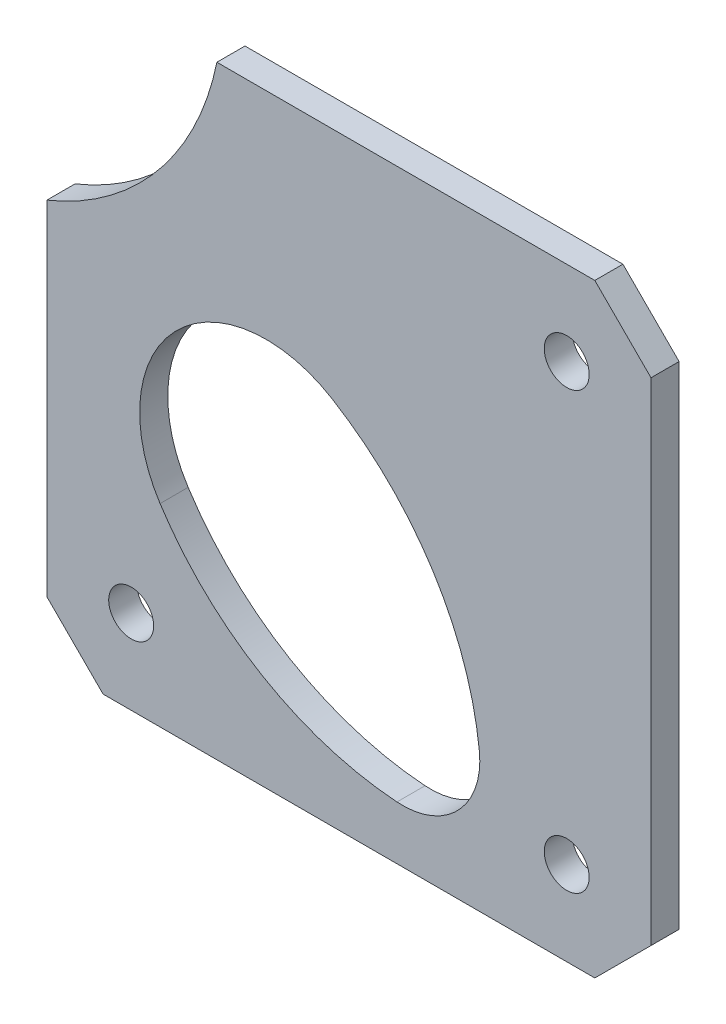
ISO-10303-21;
HEADER;
FILE_DESCRIPTION(('STEP AP214'),'2;1');
FILE_NAME('part.step','',(''),(''),'','','');
FILE_SCHEMA(('AUTOMOTIVE_DESIGN { 1 0 10303 214 1 1 1 1 }'));
ENDSEC;
DATA;
#1=APPLICATION_CONTEXT('core data for automotive mechanical design processes');
#2=APPLICATION_PROTOCOL_DEFINITION('international standard','automotive_design',2000,#1);
#3=PRODUCT_CONTEXT('',#1,'mechanical');
#4=PRODUCT('Part','Part','',(#3));
#5=PRODUCT_RELATED_PRODUCT_CATEGORY('part','',(#4));
#6=PRODUCT_DEFINITION_FORMATION('','',#4);
#7=PRODUCT_DEFINITION_CONTEXT('part definition',#1,'design');
#8=PRODUCT_DEFINITION('design','',#6,#7);
#9=PRODUCT_DEFINITION_SHAPE('','',#8);
#10=(LENGTH_UNIT() NAMED_UNIT(*) SI_UNIT(.MILLI.,.METRE.));
#11=(NAMED_UNIT(*) PLANE_ANGLE_UNIT() SI_UNIT($,.RADIAN.));
#12=(NAMED_UNIT(*) SI_UNIT($,.STERADIAN.) SOLID_ANGLE_UNIT());
#13=UNCERTAINTY_MEASURE_WITH_UNIT(LENGTH_MEASURE(1.E-05),#10,'distance_accuracy_value','');
#14=(GEOMETRIC_REPRESENTATION_CONTEXT(3) GLOBAL_UNCERTAINTY_ASSIGNED_CONTEXT((#13)) GLOBAL_UNIT_ASSIGNED_CONTEXT((#10,
#11,#12)) REPRESENTATION_CONTEXT('',''));
#15=CARTESIAN_POINT('',(0.,0.,0.));
#16=DIRECTION('',(0.,0.,1.));
#17=DIRECTION('',(1.,0.,0.));
#18=AXIS2_PLACEMENT_3D('',#15,#16,#17);
#19=CARTESIAN_POINT('',(0.,0.,2.));
#20=DIRECTION('',(0.,0.,-1.));
#21=DIRECTION('',(-1.,0.,0.));
#22=AXIS2_PLACEMENT_3D('',#19,#20,#21);
#23=PLANE('',#22);
#24=CARTESIAN_POINT('',(33.8143883028785,17.7954038510985,2.));
#25=DIRECTION('',(0.,0.,-1.));
#26=DIRECTION('',(-1.,0.,0.));
#27=AXIS2_PLACEMENT_3D('',#24,#25,#26);
#28=CIRCLE('',#27,5.5);
#29=CARTESIAN_POINT('',(39.2827909365733,18.3841080516949,2.));
#30=VERTEX_POINT('',#29);
#31=CARTESIAN_POINT('',(33.4168872246575,12.3097869402294,2.));
#32=VERTEX_POINT('',#31);
#33=EDGE_CURVE('E141',#30,#32,#28,.T.);
#34=ORIENTED_EDGE('',*,*,#33,.T.);
#35=CARTESIAN_POINT('',(35.0068915375418,34.2522545837058,2.));
#36=DIRECTION('',(0.,0.,-1.));
#37=DIRECTION('',(-1.,0.,0.));
#38=AXIS2_PLACEMENT_3D('',#35,#36,#37);
#39=CIRCLE('',#38,22.);
#40=CARTESIAN_POINT('',(16.5546613942209,22.2724714997798,2.));
#41=VERTEX_POINT('',#40);
#42=EDGE_CURVE('E133',#32,#41,#39,.T.);
#43=ORIENTED_EDGE('',*,*,#42,.T.);
#44=CARTESIAN_POINT('',(24.1033009983067,27.173291852295,2.));
#45=DIRECTION('',(0.,0.,-1.));
#46=DIRECTION('',(-1.,0.,0.));
#47=AXIS2_PLACEMENT_3D('',#44,#45,#46);
#48=CIRCLE('',#47,9.);
#49=CARTESIAN_POINT('',(28.7376921805078,34.8883691928236,2.));
#50=VERTEX_POINT('',#49);
#51=EDGE_CURVE('E144',#41,#50,#48,.T.);
#52=ORIENTED_EDGE('',*,*,#51,.T.);
#53=CARTESIAN_POINT('',(17.4091804017942,16.0292912493092,2.));
#54=DIRECTION('',(0.,0.,-1.));
#55=DIRECTION('',(-1.,0.,0.));
#56=AXIS2_PLACEMENT_3D('',#53,#54,#55);
#57=CIRCLE('',#56,22.);
#58=EDGE_CURVE('E149',#30,#50,#57,.F.);
#59=ORIENTED_EDGE('',*,*,#58,.F.);
#60=EDGE_LOOP('',(#34,#43,#52,#59));
#61=FACE_BOUND('',#60,.T.);
#62=CARTESIAN_POINT('',(45.5,45.5,2.));
#63=DIRECTION('',(0.,0.,1.));
#64=DIRECTION('',(1.,0.,0.));
#65=AXIS2_PLACEMENT_3D('',#62,#63,#64);
#66=CIRCLE('',#65,1.6);
#67=CARTESIAN_POINT('',(47.1,45.5,2.));
#68=VERTEX_POINT('',#67);
#69=EDGE_CURVE('E213',#68,#68,#66,.T.);
#70=ORIENTED_EDGE('',*,*,#69,.F.);
#71=EDGE_LOOP('',(#70));
#72=FACE_BOUND('',#71,.T.);
#73=CARTESIAN_POINT('',(14.5,14.5,2.));
#74=DIRECTION('',(0.,0.,1.));
#75=DIRECTION('',(1.,0.,0.));
#76=AXIS2_PLACEMENT_3D('',#73,#74,#75);
#77=CIRCLE('',#76,1.6);
#78=CARTESIAN_POINT('',(16.1,14.5,2.));
#79=VERTEX_POINT('',#78);
#80=EDGE_CURVE('E207',#79,#79,#77,.T.);
#81=ORIENTED_EDGE('',*,*,#80,.F.);
#82=EDGE_LOOP('',(#81));
#83=FACE_BOUND('',#82,.T.);
#84=CARTESIAN_POINT('',(45.5,14.5,2.));
#85=DIRECTION('',(0.,0.,1.));
#86=DIRECTION('',(1.,0.,0.));
#87=AXIS2_PLACEMENT_3D('',#84,#85,#86);
#88=CIRCLE('',#87,1.6);
#89=CARTESIAN_POINT('',(47.1,14.5,2.));
#90=VERTEX_POINT('',#89);
#91=EDGE_CURVE('E203',#90,#90,#88,.T.);
#92=ORIENTED_EDGE('',*,*,#91,.F.);
#93=EDGE_LOOP('',(#92));
#94=FACE_BOUND('',#93,.T.);
#95=DIRECTION('',(0.,-1.,0.));
#96=VECTOR('',#95,1.);
#97=CARTESIAN_POINT('',(51.5,0.,2.));
#98=LINE('',#97,#96);
#99=CARTESIAN_POINT('',(51.5,47.5,2.));
#100=VERTEX_POINT('',#99);
#101=CARTESIAN_POINT('',(51.5,12.5,2.));
#102=VERTEX_POINT('',#101);
#103=EDGE_CURVE('E193',#100,#102,#98,.T.);
#104=ORIENTED_EDGE('',*,*,#103,.F.);
#105=DIRECTION('',(0.707106781186547,-0.707106781186548,0.));
#106=VECTOR('',#105,1.);
#107=CARTESIAN_POINT('',(47.5,51.5,2.));
#108=LINE('',#107,#106);
#109=CARTESIAN_POINT('',(47.5,51.5,2.));
#110=VERTEX_POINT('',#109);
#111=EDGE_CURVE('E238',#100,#110,#108,.F.);
#112=ORIENTED_EDGE('',*,*,#111,.T.);
#113=DIRECTION('',(1.,0.,0.));
#114=VECTOR('',#113,1.);
#115=CARTESIAN_POINT('',(0.,51.5,2.));
#116=LINE('',#115,#114);
#117=CARTESIAN_POINT('',(20.6,51.5,2.));
#118=VERTEX_POINT('',#117);
#119=EDGE_CURVE('E189',#118,#110,#116,.T.);
#120=ORIENTED_EDGE('',*,*,#119,.F.);
#121=CARTESIAN_POINT('',(1.00233698849756,55.4914414047546,2.));
#122=DIRECTION('',(0.,0.,-1.));
#123=DIRECTION('',(-1.,0.,0.));
#124=AXIS2_PLACEMENT_3D('',#121,#122,#123);
#125=CIRCLE('',#124,20.);
#126=CARTESIAN_POINT('',(8.50000000000001,36.95,2.));
#127=VERTEX_POINT('',#126);
#128=EDGE_CURVE('E200',#127,#118,#125,.F.);
#129=ORIENTED_EDGE('',*,*,#128,.F.);
#130=DIRECTION('',(0.,1.,0.));
#131=VECTOR('',#130,1.);
#132=CARTESIAN_POINT('',(8.5,0.,2.));
#133=LINE('',#132,#131);
#134=CARTESIAN_POINT('',(8.5,12.5,2.));
#135=VERTEX_POINT('',#134);
#136=EDGE_CURVE('E198',#135,#127,#133,.T.);
#137=ORIENTED_EDGE('',*,*,#136,.F.);
#138=DIRECTION('',(-0.707106781186547,0.707106781186548,0.));
#139=VECTOR('',#138,1.);
#140=CARTESIAN_POINT('',(12.5,8.49999999999999,2.));
#141=LINE('',#140,#139);
#142=CARTESIAN_POINT('',(12.5,8.49999999999999,2.));
#143=VERTEX_POINT('',#142);
#144=EDGE_CURVE('E54',#135,#143,#141,.F.);
#145=ORIENTED_EDGE('',*,*,#144,.T.);
#146=DIRECTION('',(-1.,0.,0.));
#147=VECTOR('',#146,1.);
#148=CARTESIAN_POINT('',(0.,8.49999999999999,2.));
#149=LINE('',#148,#147);
#150=CARTESIAN_POINT('',(47.5,8.49999999999999,2.));
#151=VERTEX_POINT('',#150);
#152=EDGE_CURVE('E196',#151,#143,#149,.T.);
#153=ORIENTED_EDGE('',*,*,#152,.F.);
#154=DIRECTION('',(-0.707106781186549,-0.707106781186546,0.));
#155=VECTOR('',#154,1.);
#156=CARTESIAN_POINT('',(51.5,12.5,2.));
#157=LINE('',#156,#155);
#158=EDGE_CURVE('E235',#151,#102,#157,.F.);
#159=ORIENTED_EDGE('',*,*,#158,.T.);
#160=EDGE_LOOP('',(#104,#112,#120,#129,#137,#145,#153,#159));
#161=FACE_BOUND('',#160,.T.);
#162=ADVANCED_FACE('F39',(#61,#72,#83,#94,#161),#23,.F.);
#163=CARTESIAN_POINT('',(0.,0.,0.));
#164=DIRECTION('',(0.,0.,-1.));
#165=DIRECTION('',(-1.,0.,0.));
#166=AXIS2_PLACEMENT_3D('',#163,#164,#165);
#167=PLANE('',#166);
#168=CARTESIAN_POINT('',(35.0068915375418,34.2522545837058,0.));
#169=DIRECTION('',(0.,0.,-1.));
#170=DIRECTION('',(-1.,0.,0.));
#171=AXIS2_PLACEMENT_3D('',#168,#169,#170);
#172=CIRCLE('',#171,22.);
#173=CARTESIAN_POINT('',(33.4168872246575,12.3097869402294,0.));
#174=VERTEX_POINT('',#173);
#175=CARTESIAN_POINT('',(16.5546613942209,22.2724714997798,0.));
#176=VERTEX_POINT('',#175);
#177=EDGE_CURVE('E136',#174,#176,#172,.T.);
#178=ORIENTED_EDGE('',*,*,#177,.F.);
#179=CARTESIAN_POINT('',(33.8143883028785,17.7954038510985,0.));
#180=DIRECTION('',(0.,0.,-1.));
#181=DIRECTION('',(-1.,0.,0.));
#182=AXIS2_PLACEMENT_3D('',#179,#180,#181);
#183=CIRCLE('',#182,5.5);
#184=CARTESIAN_POINT('',(39.2827909365733,18.3841080516949,0.));
#185=VERTEX_POINT('',#184);
#186=EDGE_CURVE('E153',#185,#174,#183,.T.);
#187=ORIENTED_EDGE('',*,*,#186,.F.);
#188=CARTESIAN_POINT('',(17.4091804017942,16.0292912493092,0.));
#189=DIRECTION('',(0.,0.,-1.));
#190=DIRECTION('',(-1.,0.,0.));
#191=AXIS2_PLACEMENT_3D('',#188,#189,#190);
#192=CIRCLE('',#191,22.);
#193=CARTESIAN_POINT('',(28.7376921805078,34.8883691928236,0.));
#194=VERTEX_POINT('',#193);
#195=EDGE_CURVE('E156',#185,#194,#192,.F.);
#196=ORIENTED_EDGE('',*,*,#195,.T.);
#197=CARTESIAN_POINT('',(24.1033009983067,27.173291852295,0.));
#198=DIRECTION('',(0.,0.,-1.));
#199=DIRECTION('',(-1.,0.,0.));
#200=AXIS2_PLACEMENT_3D('',#197,#198,#199);
#201=CIRCLE('',#200,9.);
#202=EDGE_CURVE('E162',#176,#194,#201,.T.);
#203=ORIENTED_EDGE('',*,*,#202,.F.);
#204=EDGE_LOOP('',(#178,#187,#196,#203));
#205=FACE_BOUND('',#204,.T.);
#206=CARTESIAN_POINT('',(45.5,45.5,0.));
#207=DIRECTION('',(0.,0.,1.));
#208=DIRECTION('',(1.,0.,0.));
#209=AXIS2_PLACEMENT_3D('',#206,#207,#208);
#210=CIRCLE('',#209,1.6);
#211=CARTESIAN_POINT('',(47.1,45.5,0.));
#212=VERTEX_POINT('',#211);
#213=EDGE_CURVE('E216',#212,#212,#210,.T.);
#214=ORIENTED_EDGE('',*,*,#213,.T.);
#215=EDGE_LOOP('',(#214));
#216=FACE_BOUND('',#215,.T.);
#217=CARTESIAN_POINT('',(14.5,14.5,0.));
#218=DIRECTION('',(0.,0.,1.));
#219=DIRECTION('',(1.,0.,0.));
#220=AXIS2_PLACEMENT_3D('',#217,#218,#219);
#221=CIRCLE('',#220,1.6);
#222=CARTESIAN_POINT('',(16.1,14.5,0.));
#223=VERTEX_POINT('',#222);
#224=EDGE_CURVE('E210',#223,#223,#221,.T.);
#225=ORIENTED_EDGE('',*,*,#224,.T.);
#226=EDGE_LOOP('',(#225));
#227=FACE_BOUND('',#226,.T.);
#228=CARTESIAN_POINT('',(45.5,14.5,0.));
#229=DIRECTION('',(0.,0.,1.));
#230=DIRECTION('',(1.,0.,0.));
#231=AXIS2_PLACEMENT_3D('',#228,#229,#230);
#232=CIRCLE('',#231,1.6);
#233=CARTESIAN_POINT('',(47.1,14.5,0.));
#234=VERTEX_POINT('',#233);
#235=EDGE_CURVE('E204',#234,#234,#232,.T.);
#236=ORIENTED_EDGE('',*,*,#235,.T.);
#237=EDGE_LOOP('',(#236));
#238=FACE_BOUND('',#237,.T.);
#239=DIRECTION('',(1.,0.,0.));
#240=VECTOR('',#239,1.);
#241=CARTESIAN_POINT('',(20.6,51.5,0.));
#242=LINE('',#241,#240);
#243=CARTESIAN_POINT('',(20.6,51.5,0.));
#244=VERTEX_POINT('',#243);
#245=CARTESIAN_POINT('',(47.5,51.5,0.));
#246=VERTEX_POINT('',#245);
#247=EDGE_CURVE('E174',#244,#246,#242,.T.);
#248=ORIENTED_EDGE('',*,*,#247,.T.);
#249=DIRECTION('',(-0.707106781186547,0.707106781186548,0.));
#250=VECTOR('',#249,1.);
#251=CARTESIAN_POINT('',(49.5,49.5,0.));
#252=LINE('',#251,#250);
#253=CARTESIAN_POINT('',(51.5,47.5,0.));
#254=VERTEX_POINT('',#253);
#255=EDGE_CURVE('E228',#246,#254,#252,.F.);
#256=ORIENTED_EDGE('',*,*,#255,.T.);
#257=DIRECTION('',(0.,-1.,0.));
#258=VECTOR('',#257,1.);
#259=CARTESIAN_POINT('',(51.5,51.5,0.));
#260=LINE('',#259,#258);
#261=CARTESIAN_POINT('',(51.5,12.5,0.));
#262=VERTEX_POINT('',#261);
#263=EDGE_CURVE('E177',#254,#262,#260,.T.);
#264=ORIENTED_EDGE('',*,*,#263,.T.);
#265=DIRECTION('',(0.707106781186549,0.707106781186546,0.));
#266=VECTOR('',#265,1.);
#267=CARTESIAN_POINT('',(19.4999999999999,-19.5,0.));
#268=LINE('',#267,#266);
#269=CARTESIAN_POINT('',(47.5,8.49999999999999,0.));
#270=VERTEX_POINT('',#269);
#271=EDGE_CURVE('E224',#262,#270,#268,.F.);
#272=ORIENTED_EDGE('',*,*,#271,.T.);
#273=DIRECTION('',(-1.,0.,0.));
#274=VECTOR('',#273,1.);
#275=CARTESIAN_POINT('',(51.5,8.49999999999999,0.));
#276=LINE('',#275,#274);
#277=CARTESIAN_POINT('',(12.5,8.5,0.));
#278=VERTEX_POINT('',#277);
#279=EDGE_CURVE('E180',#270,#278,#276,.T.);
#280=ORIENTED_EDGE('',*,*,#279,.T.);
#281=DIRECTION('',(0.707106781186547,-0.707106781186548,0.));
#282=VECTOR('',#281,1.);
#283=CARTESIAN_POINT('',(10.5,10.5,0.));
#284=LINE('',#283,#282);
#285=CARTESIAN_POINT('',(8.5,12.5,0.));
#286=VERTEX_POINT('',#285);
#287=EDGE_CURVE('E226',#278,#286,#284,.F.);
#288=ORIENTED_EDGE('',*,*,#287,.T.);
#289=DIRECTION('',(0.,1.,0.));
#290=VECTOR('',#289,1.);
#291=CARTESIAN_POINT('',(8.50000000000001,36.95,0.));
#292=LINE('',#291,#290);
#293=CARTESIAN_POINT('',(8.50000000000001,36.95,0.));
#294=VERTEX_POINT('',#293);
#295=EDGE_CURVE('E183',#286,#294,#292,.T.);
#296=ORIENTED_EDGE('',*,*,#295,.T.);
#297=CARTESIAN_POINT('',(1.00233698849756,55.4914414047546,0.));
#298=DIRECTION('',(0.,0.,1.));
#299=DIRECTION('',(-1.,0.,0.));
#300=AXIS2_PLACEMENT_3D('',#297,#298,#299);
#301=CIRCLE('',#300,20.);
#302=EDGE_CURVE('E168',#294,#244,#301,.T.);
#303=ORIENTED_EDGE('',*,*,#302,.T.);
#304=EDGE_LOOP('',(#248,#256,#264,#272,#280,#288,#296,#303));
#305=FACE_BOUND('',#304,.T.);
#306=ADVANCED_FACE('F245',(#205,#216,#227,#238,#305),#167,.T.);
#307=CARTESIAN_POINT('',(45.5,45.5,0.));
#308=DIRECTION('',(0.,0.,1.));
#309=DIRECTION('',(1.,0.,0.));
#310=AXIS2_PLACEMENT_3D('',#307,#308,#309);
#311=CYLINDRICAL_SURFACE('',#310,1.6);
#312=ORIENTED_EDGE('',*,*,#213,.F.);
#313=EDGE_LOOP('',(#312));
#314=FACE_BOUND('',#313,.T.);
#315=ORIENTED_EDGE('',*,*,#69,.T.);
#316=EDGE_LOOP('',(#315));
#317=FACE_BOUND('',#316,.T.);
#318=ADVANCED_FACE('F287',(#314,#317),#311,.F.);
#319=CARTESIAN_POINT('',(14.5,14.5,0.));
#320=DIRECTION('',(0.,0.,1.));
#321=DIRECTION('',(1.,0.,0.));
#322=AXIS2_PLACEMENT_3D('',#319,#320,#321);
#323=CYLINDRICAL_SURFACE('',#322,1.6);
#324=ORIENTED_EDGE('',*,*,#224,.F.);
#325=EDGE_LOOP('',(#324));
#326=FACE_BOUND('',#325,.T.);
#327=ORIENTED_EDGE('',*,*,#80,.T.);
#328=EDGE_LOOP('',(#327));
#329=FACE_BOUND('',#328,.T.);
#330=ADVANCED_FACE('F407',(#326,#329),#323,.F.);
#331=CARTESIAN_POINT('',(45.5,14.5,0.));
#332=DIRECTION('',(0.,0.,1.));
#333=DIRECTION('',(1.,0.,0.));
#334=AXIS2_PLACEMENT_3D('',#331,#332,#333);
#335=CYLINDRICAL_SURFACE('',#334,1.6);
#336=ORIENTED_EDGE('',*,*,#235,.F.);
#337=EDGE_LOOP('',(#336));
#338=FACE_BOUND('',#337,.T.);
#339=ORIENTED_EDGE('',*,*,#91,.T.);
#340=EDGE_LOOP('',(#339));
#341=FACE_BOUND('',#340,.T.);
#342=ADVANCED_FACE('F279',(#338,#341),#335,.F.);
#343=CARTESIAN_POINT('',(1.00233698849756,55.4914414047546,10.));
#344=DIRECTION('',(0.,0.,-1.));
#345=DIRECTION('',(-1.,0.,0.));
#346=AXIS2_PLACEMENT_3D('',#343,#344,#345);
#347=CYLINDRICAL_SURFACE('',#346,20.);
#348=ORIENTED_EDGE('',*,*,#128,.T.);
#349=DIRECTION('',(0.,0.,-1.));
#350=VECTOR('',#349,1.);
#351=CARTESIAN_POINT('',(20.6,51.5,10.));
#352=LINE('',#351,#350);
#353=EDGE_CURVE('E185',#118,#244,#352,.T.);
#354=ORIENTED_EDGE('',*,*,#353,.T.);
#355=ORIENTED_EDGE('',*,*,#302,.F.);
#356=DIRECTION('',(0.,0.,-1.));
#357=VECTOR('',#356,1.);
#358=CARTESIAN_POINT('',(8.50000000000001,36.95,10.));
#359=LINE('',#358,#357);
#360=EDGE_CURVE('E186',#127,#294,#359,.T.);
#361=ORIENTED_EDGE('',*,*,#360,.F.);
#362=EDGE_LOOP('',(#348,#354,#355,#361));
#363=FACE_BOUND('',#362,.T.);
#364=ADVANCED_FACE('F266',(#363),#347,.F.);
#365=CARTESIAN_POINT('',(8.50000000000001,36.95,10.));
#366=DIRECTION('',(-1.,0.,0.));
#367=DIRECTION('',(0.,-1.,0.));
#368=AXIS2_PLACEMENT_3D('',#365,#366,#367);
#369=PLANE('',#368);
#370=ORIENTED_EDGE('',*,*,#295,.F.);
#371=DIRECTION('',(0.,0.,1.));
#372=VECTOR('',#371,1.);
#373=CARTESIAN_POINT('',(8.5,12.5,10.));
#374=LINE('',#373,#372);
#375=EDGE_CURVE('E12',#286,#135,#374,.T.);
#376=ORIENTED_EDGE('',*,*,#375,.T.);
#377=ORIENTED_EDGE('',*,*,#136,.T.);
#378=ORIENTED_EDGE('',*,*,#360,.T.);
#379=EDGE_LOOP('',(#370,#376,#377,#378));
#380=FACE_BOUND('',#379,.T.);
#381=ADVANCED_FACE('F271',(#380),#369,.T.);
#382=CARTESIAN_POINT('',(51.5,8.49999999999999,10.));
#383=DIRECTION('',(0.,-1.,0.));
#384=DIRECTION('',(1.,0.,0.));
#385=AXIS2_PLACEMENT_3D('',#382,#383,#384);
#386=PLANE('',#385);
#387=ORIENTED_EDGE('',*,*,#152,.T.);
#388=DIRECTION('',(0.,0.,-1.));
#389=VECTOR('',#388,1.);
#390=CARTESIAN_POINT('',(12.5,8.49999999999999,10.));
#391=LINE('',#390,#389);
#392=EDGE_CURVE('E47',#143,#278,#391,.T.);
#393=ORIENTED_EDGE('',*,*,#392,.T.);
#394=ORIENTED_EDGE('',*,*,#279,.F.);
#395=DIRECTION('',(0.,0.,1.));
#396=VECTOR('',#395,1.);
#397=CARTESIAN_POINT('',(47.5,8.49999999999999,10.));
#398=LINE('',#397,#396);
#399=EDGE_CURVE('E61',#270,#151,#398,.T.);
#400=ORIENTED_EDGE('',*,*,#399,.T.);
#401=EDGE_LOOP('',(#387,#393,#394,#400));
#402=FACE_BOUND('',#401,.T.);
#403=ADVANCED_FACE('F242',(#402),#386,.T.);
#404=CARTESIAN_POINT('',(51.5,51.5,10.));
#405=DIRECTION('',(1.,0.,0.));
#406=DIRECTION('',(0.,1.,0.));
#407=AXIS2_PLACEMENT_3D('',#404,#405,#406);
#408=PLANE('',#407);
#409=ORIENTED_EDGE('',*,*,#263,.F.);
#410=DIRECTION('',(0.,0.,1.));
#411=VECTOR('',#410,1.);
#412=CARTESIAN_POINT('',(51.5,47.5,10.));
#413=LINE('',#412,#411);
#414=EDGE_CURVE('E233',#254,#100,#413,.T.);
#415=ORIENTED_EDGE('',*,*,#414,.T.);
#416=ORIENTED_EDGE('',*,*,#103,.T.);
#417=DIRECTION('',(0.,0.,-1.));
#418=VECTOR('',#417,1.);
#419=CARTESIAN_POINT('',(51.5,12.5,10.));
#420=LINE('',#419,#418);
#421=EDGE_CURVE('E230',#102,#262,#420,.T.);
#422=ORIENTED_EDGE('',*,*,#421,.T.);
#423=EDGE_LOOP('',(#409,#415,#416,#422));
#424=FACE_BOUND('',#423,.T.);
#425=ADVANCED_FACE('F252',(#424),#408,.T.);
#426=CARTESIAN_POINT('',(20.6,51.5,10.));
#427=DIRECTION('',(0.,1.,0.));
#428=DIRECTION('',(-1.,0.,0.));
#429=AXIS2_PLACEMENT_3D('',#426,#427,#428);
#430=PLANE('',#429);
#431=ORIENTED_EDGE('',*,*,#119,.T.);
#432=DIRECTION('',(0.,0.,-1.));
#433=VECTOR('',#432,1.);
#434=CARTESIAN_POINT('',(47.5,51.5,10.));
#435=LINE('',#434,#433);
#436=EDGE_CURVE('E219',#110,#246,#435,.T.);
#437=ORIENTED_EDGE('',*,*,#436,.T.);
#438=ORIENTED_EDGE('',*,*,#247,.F.);
#439=ORIENTED_EDGE('',*,*,#353,.F.);
#440=EDGE_LOOP('',(#431,#437,#438,#439));
#441=FACE_BOUND('',#440,.T.);
#442=ADVANCED_FACE('F262',(#441),#430,.T.);
#443=CARTESIAN_POINT('',(35.0068915375418,34.2522545837058,2.));
#444=DIRECTION('',(0.,0.,-1.));
#445=DIRECTION('',(-1.,0.,0.));
#446=AXIS2_PLACEMENT_3D('',#443,#444,#445);
#447=CYLINDRICAL_SURFACE('',#446,22.);
#448=ORIENTED_EDGE('',*,*,#177,.T.);
#449=DIRECTION('',(0.,0.,-1.));
#450=VECTOR('',#449,1.);
#451=CARTESIAN_POINT('',(16.5546613942209,22.2724714997798,2.));
#452=LINE('',#451,#450);
#453=EDGE_CURVE('E129',#41,#176,#452,.T.);
#454=ORIENTED_EDGE('',*,*,#453,.F.);
#455=ORIENTED_EDGE('',*,*,#42,.F.);
#456=DIRECTION('',(0.,0.,-1.));
#457=VECTOR('',#456,1.);
#458=CARTESIAN_POINT('',(33.4168872246575,12.3097869402294,2.));
#459=LINE('',#458,#457);
#460=EDGE_CURVE('E166',#32,#174,#459,.T.);
#461=ORIENTED_EDGE('',*,*,#460,.T.);
#462=EDGE_LOOP('',(#448,#454,#455,#461));
#463=FACE_BOUND('',#462,.T.);
#464=ADVANCED_FACE('F131',(#463),#447,.F.);
#465=CARTESIAN_POINT('',(33.8143883028785,17.7954038510985,2.));
#466=DIRECTION('',(0.,0.,-1.));
#467=DIRECTION('',(-1.,0.,0.));
#468=AXIS2_PLACEMENT_3D('',#465,#466,#467);
#469=CYLINDRICAL_SURFACE('',#468,5.5);
#470=ORIENTED_EDGE('',*,*,#186,.T.);
#471=ORIENTED_EDGE('',*,*,#460,.F.);
#472=ORIENTED_EDGE('',*,*,#33,.F.);
#473=DIRECTION('',(0.,0.,-1.));
#474=VECTOR('',#473,1.);
#475=CARTESIAN_POINT('',(39.2827909365733,18.3841080516949,2.));
#476=LINE('',#475,#474);
#477=EDGE_CURVE('E169',#30,#185,#476,.T.);
#478=ORIENTED_EDGE('',*,*,#477,.T.);
#479=EDGE_LOOP('',(#470,#471,#472,#478));
#480=FACE_BOUND('',#479,.T.);
#481=ADVANCED_FACE('F375',(#480),#469,.F.);
#482=CARTESIAN_POINT('',(17.4091804017942,16.0292912493092,2.));
#483=DIRECTION('',(0.,0.,-1.));
#484=DIRECTION('',(-1.,0.,0.));
#485=AXIS2_PLACEMENT_3D('',#482,#483,#484);
#486=CYLINDRICAL_SURFACE('',#485,22.);
#487=ORIENTED_EDGE('',*,*,#195,.F.);
#488=ORIENTED_EDGE('',*,*,#477,.F.);
#489=ORIENTED_EDGE('',*,*,#58,.T.);
#490=DIRECTION('',(0.,0.,-1.));
#491=VECTOR('',#490,1.);
#492=CARTESIAN_POINT('',(28.7376921805078,34.8883691928236,2.));
#493=LINE('',#492,#491);
#494=EDGE_CURVE('E140',#50,#194,#493,.T.);
#495=ORIENTED_EDGE('',*,*,#494,.T.);
#496=EDGE_LOOP('',(#487,#488,#489,#495));
#497=FACE_BOUND('',#496,.T.);
#498=ADVANCED_FACE('F365',(#497),#486,.F.);
#499=CARTESIAN_POINT('',(24.1033009983067,27.173291852295,2.));
#500=DIRECTION('',(0.,0.,-1.));
#501=DIRECTION('',(-1.,0.,0.));
#502=AXIS2_PLACEMENT_3D('',#499,#500,#501);
#503=CYLINDRICAL_SURFACE('',#502,9.);
#504=ORIENTED_EDGE('',*,*,#202,.T.);
#505=ORIENTED_EDGE('',*,*,#494,.F.);
#506=ORIENTED_EDGE('',*,*,#51,.F.);
#507=ORIENTED_EDGE('',*,*,#453,.T.);
#508=EDGE_LOOP('',(#504,#505,#506,#507));
#509=FACE_BOUND('',#508,.T.);
#510=ADVANCED_FACE('F145',(#509),#503,.F.);
#511=CARTESIAN_POINT('',(47.5,51.5,10.));
#512=DIRECTION('',(-0.707106781186548,-0.707106781186547,0.));
#513=DIRECTION('',(0.,0.,-1.));
#514=AXIS2_PLACEMENT_3D('',#511,#512,#513);
#515=PLANE('',#514);
#516=ORIENTED_EDGE('',*,*,#111,.F.);
#517=ORIENTED_EDGE('',*,*,#414,.F.);
#518=ORIENTED_EDGE('',*,*,#255,.F.);
#519=ORIENTED_EDGE('',*,*,#436,.F.);
#520=EDGE_LOOP('',(#516,#517,#518,#519));
#521=FACE_BOUND('',#520,.T.);
#522=ADVANCED_FACE('F259',(#521),#515,.F.);
#523=CARTESIAN_POINT('',(12.5,8.49999999999999,10.));
#524=DIRECTION('',(0.707106781186548,0.707106781186547,0.));
#525=DIRECTION('',(0.,0.,-1.));
#526=AXIS2_PLACEMENT_3D('',#523,#524,#525);
#527=PLANE('',#526);
#528=ORIENTED_EDGE('',*,*,#144,.F.);
#529=ORIENTED_EDGE('',*,*,#375,.F.);
#530=ORIENTED_EDGE('',*,*,#287,.F.);
#531=ORIENTED_EDGE('',*,*,#392,.F.);
#532=EDGE_LOOP('',(#528,#529,#530,#531));
#533=FACE_BOUND('',#532,.T.);
#534=ADVANCED_FACE('F270',(#533),#527,.F.);
#535=CARTESIAN_POINT('',(51.5,12.5,10.));
#536=DIRECTION('',(-0.707106781186546,0.707106781186549,0.));
#537=DIRECTION('',(0.,0.,-1.));
#538=AXIS2_PLACEMENT_3D('',#535,#536,#537);
#539=PLANE('',#538);
#540=ORIENTED_EDGE('',*,*,#158,.F.);
#541=ORIENTED_EDGE('',*,*,#399,.F.);
#542=ORIENTED_EDGE('',*,*,#271,.F.);
#543=ORIENTED_EDGE('',*,*,#421,.F.);
#544=EDGE_LOOP('',(#540,#541,#542,#543));
#545=FACE_BOUND('',#544,.T.);
#546=ADVANCED_FACE('F41',(#545),#539,.F.);
#547=CLOSED_SHELL('',(#162,#306,#318,#330,#342,#364,#381,#403,#425,#442,#464,#481,#498,#510,
#522,#534,#546));
#548=MANIFOLD_SOLID_BREP('B2',#547);
#549=ADVANCED_BREP_SHAPE_REPRESENTATION('',(#18,#548),#14);
#550=SHAPE_DEFINITION_REPRESENTATION(#9,#549);
ENDSEC;
END-ISO-10303-21;
